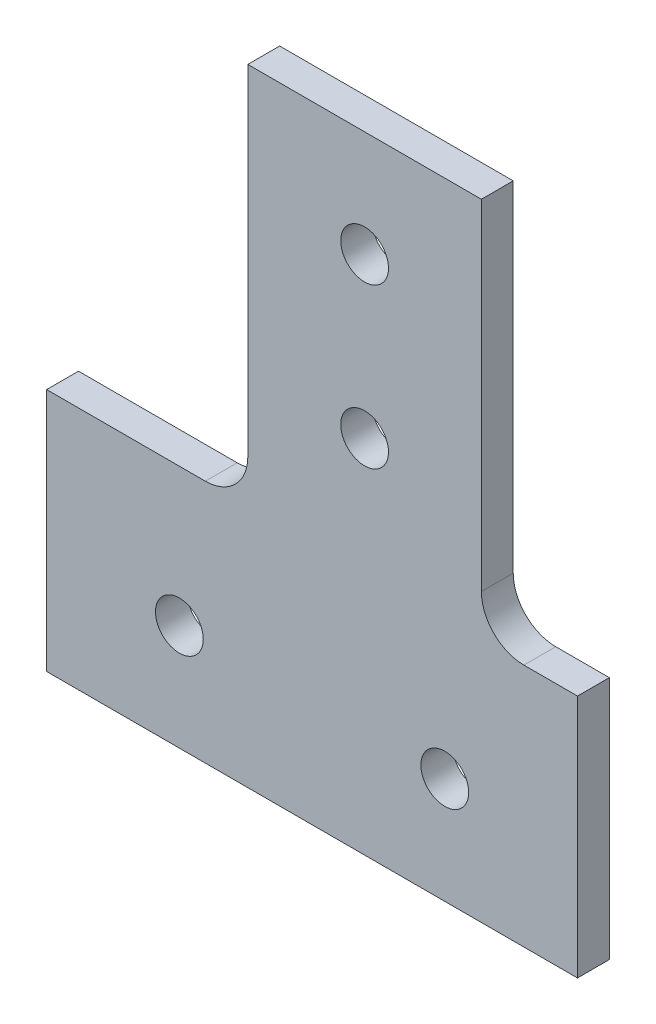
ISO-10303-21;
HEADER;
FILE_DESCRIPTION(('STEP AP214'),'2;1');
FILE_NAME('part.step','',(''),(''),'','','');
FILE_SCHEMA(('AUTOMOTIVE_DESIGN { 1 0 10303 214 1 1 1 1 }'));
ENDSEC;
DATA;
#1=APPLICATION_CONTEXT('core data for automotive mechanical design processes');
#2=APPLICATION_PROTOCOL_DEFINITION('international standard','automotive_design',2000,#1);
#3=PRODUCT_CONTEXT('',#1,'mechanical');
#4=PRODUCT('Part','Part','',(#3));
#5=PRODUCT_RELATED_PRODUCT_CATEGORY('part','',(#4));
#6=PRODUCT_DEFINITION_FORMATION('','',#4);
#7=PRODUCT_DEFINITION_CONTEXT('part definition',#1,'design');
#8=PRODUCT_DEFINITION('design','',#6,#7);
#9=PRODUCT_DEFINITION_SHAPE('','',#8);
#10=(LENGTH_UNIT() NAMED_UNIT(*) SI_UNIT(.MILLI.,.METRE.));
#11=(NAMED_UNIT(*) PLANE_ANGLE_UNIT() SI_UNIT($,.RADIAN.));
#12=(NAMED_UNIT(*) SI_UNIT($,.STERADIAN.) SOLID_ANGLE_UNIT());
#13=UNCERTAINTY_MEASURE_WITH_UNIT(LENGTH_MEASURE(1.E-05),#10,'distance_accuracy_value','');
#14=(GEOMETRIC_REPRESENTATION_CONTEXT(3) GLOBAL_UNCERTAINTY_ASSIGNED_CONTEXT((#13)) GLOBAL_UNIT_ASSIGNED_CONTEXT((#10,
#11,#12)) REPRESENTATION_CONTEXT('',''));
#15=CARTESIAN_POINT('',(0.,0.,0.));
#16=DIRECTION('',(0.,0.,1.));
#17=DIRECTION('',(1.,0.,0.));
#18=AXIS2_PLACEMENT_3D('',#15,#16,#17);
#19=CARTESIAN_POINT('',(-25.,-11.5,3.));
#20=DIRECTION('',(1.,0.,0.));
#21=DIRECTION('',(0.,0.,-1.));
#22=AXIS2_PLACEMENT_3D('',#19,#20,#21);
#23=PLANE('',#22);
#24=DIRECTION('',(0.,-1.,0.));
#25=VECTOR('',#24,1.);
#26=CARTESIAN_POINT('',(-25.,-11.5,0.));
#27=LINE('',#26,#25);
#28=CARTESIAN_POINT('',(-25.,11.5,0.));
#29=VERTEX_POINT('',#28);
#30=CARTESIAN_POINT('',(-25.,-11.5,0.));
#31=VERTEX_POINT('',#30);
#32=EDGE_CURVE('E150',#29,#31,#27,.T.);
#33=ORIENTED_EDGE('',*,*,#32,.T.);
#34=DIRECTION('',(0.,0.,-1.));
#35=VECTOR('',#34,1.);
#36=CARTESIAN_POINT('',(-25.,-11.5,3.));
#37=LINE('',#36,#35);
#38=CARTESIAN_POINT('',(-25.,-11.5,3.));
#39=VERTEX_POINT('',#38);
#40=EDGE_CURVE('E11',#39,#31,#37,.T.);
#41=ORIENTED_EDGE('',*,*,#40,.F.);
#42=DIRECTION('',(0.,-1.,0.));
#43=VECTOR('',#42,1.);
#44=CARTESIAN_POINT('',(-25.,-11.5,3.));
#45=LINE('',#44,#43);
#46=CARTESIAN_POINT('',(-25.,11.5,3.));
#47=VERTEX_POINT('',#46);
#48=EDGE_CURVE('E169',#47,#39,#45,.T.);
#49=ORIENTED_EDGE('',*,*,#48,.F.);
#50=DIRECTION('',(0.,0.,-1.));
#51=VECTOR('',#50,1.);
#52=CARTESIAN_POINT('',(-25.,11.5,3.));
#53=LINE('',#52,#51);
#54=EDGE_CURVE('E146',#47,#29,#53,.T.);
#55=ORIENTED_EDGE('',*,*,#54,.T.);
#56=EDGE_LOOP('',(#33,#41,#49,#55));
#57=FACE_BOUND('',#56,.T.);
#58=ADVANCED_FACE('F39',(#57),#23,.F.);
#59=CARTESIAN_POINT('',(25.,-11.5,3.));
#60=DIRECTION('',(0.,1.,0.));
#61=DIRECTION('',(-1.,0.,0.));
#62=AXIS2_PLACEMENT_3D('',#59,#60,#61);
#63=PLANE('',#62);
#64=DIRECTION('',(1.,0.,0.));
#65=VECTOR('',#64,1.);
#66=CARTESIAN_POINT('',(25.,-11.5,0.));
#67=LINE('',#66,#65);
#68=CARTESIAN_POINT('',(25.,-11.5,0.));
#69=VERTEX_POINT('',#68);
#70=EDGE_CURVE('E153',#31,#69,#67,.T.);
#71=ORIENTED_EDGE('',*,*,#70,.T.);
#72=DIRECTION('',(0.,0.,-1.));
#73=VECTOR('',#72,1.);
#74=CARTESIAN_POINT('',(25.,-11.5,3.));
#75=LINE('',#74,#73);
#76=CARTESIAN_POINT('',(25.,-11.5,3.));
#77=VERTEX_POINT('',#76);
#78=EDGE_CURVE('E46',#77,#69,#75,.T.);
#79=ORIENTED_EDGE('',*,*,#78,.F.);
#80=DIRECTION('',(1.,0.,0.));
#81=VECTOR('',#80,1.);
#82=CARTESIAN_POINT('',(25.,-11.5,3.));
#83=LINE('',#82,#81);
#84=EDGE_CURVE('E103',#39,#77,#83,.T.);
#85=ORIENTED_EDGE('',*,*,#84,.F.);
#86=ORIENTED_EDGE('',*,*,#40,.T.);
#87=EDGE_LOOP('',(#71,#79,#85,#86));
#88=FACE_BOUND('',#87,.T.);
#89=ADVANCED_FACE('F253',(#88),#63,.F.);
#90=CARTESIAN_POINT('',(25.,-11.5,3.));
#91=DIRECTION('',(-1.,0.,0.));
#92=DIRECTION('',(0.,0.,1.));
#93=AXIS2_PLACEMENT_3D('',#90,#91,#92);
#94=PLANE('',#93);
#95=DIRECTION('',(0.,1.,0.));
#96=VECTOR('',#95,1.);
#97=CARTESIAN_POINT('',(25.,-11.5,0.));
#98=LINE('',#97,#96);
#99=CARTESIAN_POINT('',(25.,11.5,0.));
#100=VERTEX_POINT('',#99);
#101=EDGE_CURVE('E156',#69,#100,#98,.T.);
#102=ORIENTED_EDGE('',*,*,#101,.T.);
#103=DIRECTION('',(0.,0.,-1.));
#104=VECTOR('',#103,1.);
#105=CARTESIAN_POINT('',(25.,11.5,3.));
#106=LINE('',#105,#104);
#107=CARTESIAN_POINT('',(25.,11.5,3.));
#108=VERTEX_POINT('',#107);
#109=EDGE_CURVE('E177',#108,#100,#106,.T.);
#110=ORIENTED_EDGE('',*,*,#109,.F.);
#111=DIRECTION('',(0.,1.,0.));
#112=VECTOR('',#111,1.);
#113=CARTESIAN_POINT('',(25.,-11.5,3.));
#114=LINE('',#113,#112);
#115=EDGE_CURVE('E185',#77,#108,#114,.T.);
#116=ORIENTED_EDGE('',*,*,#115,.F.);
#117=ORIENTED_EDGE('',*,*,#78,.T.);
#118=EDGE_LOOP('',(#102,#110,#116,#117));
#119=FACE_BOUND('',#118,.T.);
#120=ADVANCED_FACE('F183',(#119),#94,.F.);
#121=CARTESIAN_POINT('',(25.,11.5,3.));
#122=DIRECTION('',(0.,-1.,0.));
#123=DIRECTION('',(1.,0.,0.));
#124=AXIS2_PLACEMENT_3D('',#121,#122,#123);
#125=PLANE('',#124);
#126=DIRECTION('',(-1.,0.,0.));
#127=VECTOR('',#126,1.);
#128=CARTESIAN_POINT('',(25.,11.5,0.));
#129=LINE('',#128,#127);
#130=CARTESIAN_POINT('',(19.9473911,11.5,0.));
#131=VERTEX_POINT('',#130);
#132=EDGE_CURVE('E158',#100,#131,#129,.T.);
#133=ORIENTED_EDGE('',*,*,#132,.T.);
#134=DIRECTION('',(0.,0.,-1.));
#135=VECTOR('',#134,1.);
#136=CARTESIAN_POINT('',(19.9473911,11.5,3.));
#137=LINE('',#136,#135);
#138=CARTESIAN_POINT('',(19.9473911,11.5,3.));
#139=VERTEX_POINT('',#138);
#140=EDGE_CURVE('E174',#139,#131,#137,.T.);
#141=ORIENTED_EDGE('',*,*,#140,.F.);
#142=DIRECTION('',(-1.,0.,0.));
#143=VECTOR('',#142,1.);
#144=CARTESIAN_POINT('',(25.,11.5,3.));
#145=LINE('',#144,#143);
#146=EDGE_CURVE('E202',#108,#139,#145,.T.);
#147=ORIENTED_EDGE('',*,*,#146,.F.);
#148=ORIENTED_EDGE('',*,*,#109,.T.);
#149=EDGE_LOOP('',(#133,#141,#147,#148));
#150=FACE_BOUND('',#149,.T.);
#151=ADVANCED_FACE('F194',(#150),#125,.F.);
#152=CARTESIAN_POINT('',(19.9473911,15.5,3.));
#153=DIRECTION('',(0.,0.,-1.));
#154=DIRECTION('',(-1.,0.,0.));
#155=AXIS2_PLACEMENT_3D('',#152,#153,#154);
#156=CYLINDRICAL_SURFACE('',#155,4.);
#157=CARTESIAN_POINT('',(19.9473911,15.5,0.));
#158=DIRECTION('',(0.,0.,-1.));
#159=DIRECTION('',(-1.,0.,0.));
#160=AXIS2_PLACEMENT_3D('',#157,#158,#159);
#161=CIRCLE('',#160,4.);
#162=CARTESIAN_POINT('',(15.9473911,15.5,0.));
#163=VERTEX_POINT('',#162);
#164=EDGE_CURVE('E160',#131,#163,#161,.T.);
#165=ORIENTED_EDGE('',*,*,#164,.T.);
#166=DIRECTION('',(0.,0.,-1.));
#167=VECTOR('',#166,1.);
#168=CARTESIAN_POINT('',(15.9473911,15.5,3.));
#169=LINE('',#168,#167);
#170=CARTESIAN_POINT('',(15.9473911,15.5,3.));
#171=VERTEX_POINT('',#170);
#172=EDGE_CURVE('E141',#171,#163,#169,.T.);
#173=ORIENTED_EDGE('',*,*,#172,.F.);
#174=CARTESIAN_POINT('',(19.9473911,15.5,3.));
#175=DIRECTION('',(0.,0.,-1.));
#176=DIRECTION('',(-1.,0.,0.));
#177=AXIS2_PLACEMENT_3D('',#174,#175,#176);
#178=CIRCLE('',#177,4.);
#179=EDGE_CURVE('E200',#139,#171,#178,.T.);
#180=ORIENTED_EDGE('',*,*,#179,.F.);
#181=ORIENTED_EDGE('',*,*,#140,.T.);
#182=EDGE_LOOP('',(#165,#173,#180,#181));
#183=FACE_BOUND('',#182,.T.);
#184=ADVANCED_FACE('F198',(#183),#156,.F.);
#185=CARTESIAN_POINT('',(15.9473911,15.5,3.));
#186=DIRECTION('',(-1.,0.,0.));
#187=DIRECTION('',(0.,-1.,0.));
#188=AXIS2_PLACEMENT_3D('',#185,#186,#187);
#189=PLANE('',#188);
#190=DIRECTION('',(0.,1.,0.));
#191=VECTOR('',#190,1.);
#192=CARTESIAN_POINT('',(15.9473911,15.5,0.));
#193=LINE('',#192,#191);
#194=CARTESIAN_POINT('',(15.9473911,47.5,0.));
#195=VERTEX_POINT('',#194);
#196=EDGE_CURVE('E162',#163,#195,#193,.T.);
#197=ORIENTED_EDGE('',*,*,#196,.T.);
#198=DIRECTION('',(0.,0.,1.));
#199=VECTOR('',#198,1.);
#200=CARTESIAN_POINT('',(15.9473911,47.5,0.));
#201=LINE('',#200,#199);
#202=CARTESIAN_POINT('',(15.9473911,47.5,3.));
#203=VERTEX_POINT('',#202);
#204=EDGE_CURVE('E53',#195,#203,#201,.T.);
#205=ORIENTED_EDGE('',*,*,#204,.T.);
#206=DIRECTION('',(0.,1.,0.));
#207=VECTOR('',#206,1.);
#208=CARTESIAN_POINT('',(15.9473911,15.5,3.));
#209=LINE('',#208,#207);
#210=EDGE_CURVE('E132',#171,#203,#209,.T.);
#211=ORIENTED_EDGE('',*,*,#210,.F.);
#212=ORIENTED_EDGE('',*,*,#172,.T.);
#213=EDGE_LOOP('',(#197,#205,#211,#212));
#214=FACE_BOUND('',#213,.T.);
#215=ADVANCED_FACE('F239',(#214),#189,.F.);
#216=CARTESIAN_POINT('',(-6.0526089,15.5,3.));
#217=DIRECTION('',(1.,0.,0.));
#218=DIRECTION('',(0.,0.,-1.));
#219=AXIS2_PLACEMENT_3D('',#216,#217,#218);
#220=PLANE('',#219);
#221=DIRECTION('',(0.,-1.,0.));
#222=VECTOR('',#221,1.);
#223=CARTESIAN_POINT('',(-6.0526089,15.5,3.));
#224=LINE('',#223,#222);
#225=CARTESIAN_POINT('',(-6.0526089,47.5,3.));
#226=VERTEX_POINT('',#225);
#227=CARTESIAN_POINT('',(-6.0526089,15.5,3.));
#228=VERTEX_POINT('',#227);
#229=EDGE_CURVE('E120',#226,#228,#224,.T.);
#230=ORIENTED_EDGE('',*,*,#229,.F.);
#231=DIRECTION('',(0.,0.,1.));
#232=VECTOR('',#231,1.);
#233=CARTESIAN_POINT('',(-6.0526089,47.5,0.));
#234=LINE('',#233,#232);
#235=CARTESIAN_POINT('',(-6.0526089,47.5,0.));
#236=VERTEX_POINT('',#235);
#237=EDGE_CURVE('E232',#236,#226,#234,.T.);
#238=ORIENTED_EDGE('',*,*,#237,.F.);
#239=DIRECTION('',(0.,-1.,0.));
#240=VECTOR('',#239,1.);
#241=CARTESIAN_POINT('',(-6.0526089,15.5,0.));
#242=LINE('',#241,#240);
#243=CARTESIAN_POINT('',(-6.0526089,15.5,0.));
#244=VERTEX_POINT('',#243);
#245=EDGE_CURVE('E138',#236,#244,#242,.T.);
#246=ORIENTED_EDGE('',*,*,#245,.T.);
#247=DIRECTION('',(0.,0.,-1.));
#248=VECTOR('',#247,1.);
#249=CARTESIAN_POINT('',(-6.0526089,15.5,3.));
#250=LINE('',#249,#248);
#251=EDGE_CURVE('E135',#228,#244,#250,.T.);
#252=ORIENTED_EDGE('',*,*,#251,.F.);
#253=EDGE_LOOP('',(#230,#238,#246,#252));
#254=FACE_BOUND('',#253,.T.);
#255=ADVANCED_FACE('F136',(#254),#220,.F.);
#256=CARTESIAN_POINT('',(-10.0526089,15.5,3.));
#257=DIRECTION('',(0.,0.,-1.));
#258=DIRECTION('',(-1.,0.,0.));
#259=AXIS2_PLACEMENT_3D('',#256,#257,#258);
#260=CYLINDRICAL_SURFACE('',#259,4.);
#261=CARTESIAN_POINT('',(-10.0526089,15.5,0.));
#262=DIRECTION('',(0.,0.,-1.));
#263=DIRECTION('',(1.,0.,0.));
#264=AXIS2_PLACEMENT_3D('',#261,#262,#263);
#265=CIRCLE('',#264,4.);
#266=CARTESIAN_POINT('',(-10.0526089,11.5,0.));
#267=VERTEX_POINT('',#266);
#268=EDGE_CURVE('E166',#244,#267,#265,.T.);
#269=ORIENTED_EDGE('',*,*,#268,.T.);
#270=DIRECTION('',(0.,0.,-1.));
#271=VECTOR('',#270,1.);
#272=CARTESIAN_POINT('',(-10.0526089,11.5,3.));
#273=LINE('',#272,#271);
#274=CARTESIAN_POINT('',(-10.0526089,11.5,3.));
#275=VERTEX_POINT('',#274);
#276=EDGE_CURVE('E142',#275,#267,#273,.T.);
#277=ORIENTED_EDGE('',*,*,#276,.F.);
#278=CARTESIAN_POINT('',(-10.0526089,15.5,3.));
#279=DIRECTION('',(0.,0.,-1.));
#280=DIRECTION('',(1.,0.,0.));
#281=AXIS2_PLACEMENT_3D('',#278,#279,#280);
#282=CIRCLE('',#281,4.);
#283=EDGE_CURVE('E125',#228,#275,#282,.T.);
#284=ORIENTED_EDGE('',*,*,#283,.F.);
#285=ORIENTED_EDGE('',*,*,#251,.T.);
#286=EDGE_LOOP('',(#269,#277,#284,#285));
#287=FACE_BOUND('',#286,.T.);
#288=ADVANCED_FACE('F144',(#287),#260,.F.);
#289=CARTESIAN_POINT('',(-10.0526089,11.5,3.));
#290=DIRECTION('',(0.,-1.,0.));
#291=DIRECTION('',(1.,0.,0.));
#292=AXIS2_PLACEMENT_3D('',#289,#290,#291);
#293=PLANE('',#292);
#294=DIRECTION('',(-1.,0.,0.));
#295=VECTOR('',#294,1.);
#296=CARTESIAN_POINT('',(-10.0526089,11.5,0.));
#297=LINE('',#296,#295);
#298=EDGE_CURVE('E95',#267,#29,#297,.T.);
#299=ORIENTED_EDGE('',*,*,#298,.T.);
#300=ORIENTED_EDGE('',*,*,#54,.F.);
#301=DIRECTION('',(-1.,0.,0.));
#302=VECTOR('',#301,1.);
#303=CARTESIAN_POINT('',(-10.0526089,11.5,3.));
#304=LINE('',#303,#302);
#305=EDGE_CURVE('E62',#275,#47,#304,.T.);
#306=ORIENTED_EDGE('',*,*,#305,.F.);
#307=ORIENTED_EDGE('',*,*,#276,.T.);
#308=EDGE_LOOP('',(#299,#300,#306,#307));
#309=FACE_BOUND('',#308,.T.);
#310=ADVANCED_FACE('F260',(#309),#293,.F.);
#311=CARTESIAN_POINT('',(-10.0526089,15.5,3.));
#312=DIRECTION('',(0.,0.,1.));
#313=DIRECTION('',(1.,0.,0.));
#314=AXIS2_PLACEMENT_3D('',#311,#312,#313);
#315=PLANE('',#314);
#316=DIRECTION('',(1.,0.,0.));
#317=VECTOR('',#316,1.);
#318=CARTESIAN_POINT('',(15.9473911,47.5,3.));
#319=LINE('',#318,#317);
#320=EDGE_CURVE('E129',#226,#203,#319,.T.);
#321=ORIENTED_EDGE('',*,*,#320,.F.);
#322=ORIENTED_EDGE('',*,*,#229,.T.);
#323=ORIENTED_EDGE('',*,*,#283,.T.);
#324=ORIENTED_EDGE('',*,*,#305,.T.);
#325=ORIENTED_EDGE('',*,*,#48,.T.);
#326=ORIENTED_EDGE('',*,*,#84,.T.);
#327=ORIENTED_EDGE('',*,*,#115,.T.);
#328=ORIENTED_EDGE('',*,*,#146,.T.);
#329=ORIENTED_EDGE('',*,*,#179,.T.);
#330=ORIENTED_EDGE('',*,*,#210,.T.);
#331=EDGE_LOOP('',(#321,#322,#323,#324,#325,#326,#327,#328,#329,#330));
#332=FACE_BOUND('',#331,.T.);
#333=CARTESIAN_POINT('',(-12.5,-1.5,3.));
#334=DIRECTION('',(0.,0.,1.));
#335=DIRECTION('',(1.,0.,0.));
#336=AXIS2_PLACEMENT_3D('',#333,#334,#335);
#337=CIRCLE('',#336,2.24999999999999);
#338=CARTESIAN_POINT('',(-10.25,-1.5,3.));
#339=VERTEX_POINT('',#338);
#340=EDGE_CURVE('E229',#339,#339,#337,.T.);
#341=ORIENTED_EDGE('',*,*,#340,.F.);
#342=EDGE_LOOP('',(#341));
#343=FACE_BOUND('',#342,.T.);
#344=CARTESIAN_POINT('',(12.5,-1.5,3.));
#345=DIRECTION('',(0.,0.,1.));
#346=DIRECTION('',(1.,0.,0.));
#347=AXIS2_PLACEMENT_3D('',#344,#345,#346);
#348=CIRCLE('',#347,2.24999999999999);
#349=CARTESIAN_POINT('',(14.75,-1.5,3.));
#350=VERTEX_POINT('',#349);
#351=EDGE_CURVE('E223',#350,#350,#348,.T.);
#352=ORIENTED_EDGE('',*,*,#351,.F.);
#353=EDGE_LOOP('',(#352));
#354=FACE_BOUND('',#353,.T.);
#355=CARTESIAN_POINT('',(4.9473911,37.5,3.));
#356=DIRECTION('',(0.,0.,1.));
#357=DIRECTION('',(1.,0.,0.));
#358=AXIS2_PLACEMENT_3D('',#355,#356,#357);
#359=CIRCLE('',#358,2.25);
#360=CARTESIAN_POINT('',(7.1973911,37.5,3.));
#361=VERTEX_POINT('',#360);
#362=EDGE_CURVE('E217',#361,#361,#359,.T.);
#363=ORIENTED_EDGE('',*,*,#362,.F.);
#364=EDGE_LOOP('',(#363));
#365=FACE_BOUND('',#364,.T.);
#366=CARTESIAN_POINT('',(4.94739110000001,22.5,3.));
#367=DIRECTION('',(0.,0.,1.));
#368=DIRECTION('',(1.,0.,0.));
#369=AXIS2_PLACEMENT_3D('',#366,#367,#368);
#370=CIRCLE('',#369,2.25);
#371=CARTESIAN_POINT('',(7.19739110000001,22.5,3.));
#372=VERTEX_POINT('',#371);
#373=EDGE_CURVE('E211',#372,#372,#370,.T.);
#374=ORIENTED_EDGE('',*,*,#373,.F.);
#375=EDGE_LOOP('',(#374));
#376=FACE_BOUND('',#375,.T.);
#377=ADVANCED_FACE('F122',(#332,#343,#354,#365,#376),#315,.T.);
#378=CARTESIAN_POINT('',(-10.0526089,15.5,0.));
#379=DIRECTION('',(0.,0.,1.));
#380=DIRECTION('',(1.,0.,0.));
#381=AXIS2_PLACEMENT_3D('',#378,#379,#380);
#382=PLANE('',#381);
#383=CARTESIAN_POINT('',(-12.5,-1.5,0.));
#384=DIRECTION('',(0.,0.,1.));
#385=DIRECTION('',(1.,0.,0.));
#386=AXIS2_PLACEMENT_3D('',#383,#384,#385);
#387=CIRCLE('',#386,2.24999999999999);
#388=CARTESIAN_POINT('',(-10.25,-1.5,0.));
#389=VERTEX_POINT('',#388);
#390=EDGE_CURVE('E226',#389,#389,#387,.T.);
#391=ORIENTED_EDGE('',*,*,#390,.T.);
#392=EDGE_LOOP('',(#391));
#393=FACE_BOUND('',#392,.T.);
#394=CARTESIAN_POINT('',(12.5,-1.5,0.));
#395=DIRECTION('',(0.,0.,1.));
#396=DIRECTION('',(1.,0.,0.));
#397=AXIS2_PLACEMENT_3D('',#394,#395,#396);
#398=CIRCLE('',#397,2.24999999999999);
#399=CARTESIAN_POINT('',(14.75,-1.5,0.));
#400=VERTEX_POINT('',#399);
#401=EDGE_CURVE('E220',#400,#400,#398,.T.);
#402=ORIENTED_EDGE('',*,*,#401,.T.);
#403=EDGE_LOOP('',(#402));
#404=FACE_BOUND('',#403,.T.);
#405=CARTESIAN_POINT('',(4.9473911,37.5,0.));
#406=DIRECTION('',(0.,0.,1.));
#407=DIRECTION('',(1.,0.,0.));
#408=AXIS2_PLACEMENT_3D('',#405,#406,#407);
#409=CIRCLE('',#408,2.25);
#410=CARTESIAN_POINT('',(7.1973911,37.5,0.));
#411=VERTEX_POINT('',#410);
#412=EDGE_CURVE('E214',#411,#411,#409,.T.);
#413=ORIENTED_EDGE('',*,*,#412,.T.);
#414=EDGE_LOOP('',(#413));
#415=FACE_BOUND('',#414,.T.);
#416=CARTESIAN_POINT('',(4.94739110000001,22.5,0.));
#417=DIRECTION('',(0.,0.,1.));
#418=DIRECTION('',(1.,0.,0.));
#419=AXIS2_PLACEMENT_3D('',#416,#417,#418);
#420=CIRCLE('',#419,2.25);
#421=CARTESIAN_POINT('',(7.19739110000001,22.5,0.));
#422=VERTEX_POINT('',#421);
#423=EDGE_CURVE('E154',#422,#422,#420,.T.);
#424=ORIENTED_EDGE('',*,*,#423,.T.);
#425=EDGE_LOOP('',(#424));
#426=FACE_BOUND('',#425,.T.);
#427=ORIENTED_EDGE('',*,*,#245,.F.);
#428=DIRECTION('',(1.,0.,0.));
#429=VECTOR('',#428,1.);
#430=CARTESIAN_POINT('',(15.9473911,47.5,0.));
#431=LINE('',#430,#429);
#432=EDGE_CURVE('E235',#236,#195,#431,.T.);
#433=ORIENTED_EDGE('',*,*,#432,.T.);
#434=ORIENTED_EDGE('',*,*,#196,.F.);
#435=ORIENTED_EDGE('',*,*,#164,.F.);
#436=ORIENTED_EDGE('',*,*,#132,.F.);
#437=ORIENTED_EDGE('',*,*,#101,.F.);
#438=ORIENTED_EDGE('',*,*,#70,.F.);
#439=ORIENTED_EDGE('',*,*,#32,.F.);
#440=ORIENTED_EDGE('',*,*,#298,.F.);
#441=ORIENTED_EDGE('',*,*,#268,.F.);
#442=EDGE_LOOP('',(#427,#433,#434,#435,#436,#437,#438,#439,#440,#441));
#443=FACE_BOUND('',#442,.T.);
#444=ADVANCED_FACE('F188',(#393,#404,#415,#426,#443),#382,.F.);
#445=CARTESIAN_POINT('',(4.94739110000001,22.5,3.));
#446=DIRECTION('',(0.,0.,1.));
#447=DIRECTION('',(1.,0.,0.));
#448=AXIS2_PLACEMENT_3D('',#445,#446,#447);
#449=CYLINDRICAL_SURFACE('',#448,2.25);
#450=ORIENTED_EDGE('',*,*,#423,.F.);
#451=EDGE_LOOP('',(#450));
#452=FACE_BOUND('',#451,.T.);
#453=ORIENTED_EDGE('',*,*,#373,.T.);
#454=EDGE_LOOP('',(#453));
#455=FACE_BOUND('',#454,.T.);
#456=ADVANCED_FACE('F324',(#452,#455),#449,.F.);
#457=CARTESIAN_POINT('',(4.9473911,37.5,3.));
#458=DIRECTION('',(0.,0.,1.));
#459=DIRECTION('',(1.,0.,0.));
#460=AXIS2_PLACEMENT_3D('',#457,#458,#459);
#461=CYLINDRICAL_SURFACE('',#460,2.25);
#462=ORIENTED_EDGE('',*,*,#412,.F.);
#463=EDGE_LOOP('',(#462));
#464=FACE_BOUND('',#463,.T.);
#465=ORIENTED_EDGE('',*,*,#362,.T.);
#466=EDGE_LOOP('',(#465));
#467=FACE_BOUND('',#466,.T.);
#468=ADVANCED_FACE('F332',(#464,#467),#461,.F.);
#469=CARTESIAN_POINT('',(12.5,-1.5,3.));
#470=DIRECTION('',(0.,0.,1.));
#471=DIRECTION('',(1.,0.,0.));
#472=AXIS2_PLACEMENT_3D('',#469,#470,#471);
#473=CYLINDRICAL_SURFACE('',#472,2.24999999999999);
#474=ORIENTED_EDGE('',*,*,#401,.F.);
#475=EDGE_LOOP('',(#474));
#476=FACE_BOUND('',#475,.T.);
#477=ORIENTED_EDGE('',*,*,#351,.T.);
#478=EDGE_LOOP('',(#477));
#479=FACE_BOUND('',#478,.T.);
#480=ADVANCED_FACE('F249',(#476,#479),#473,.F.);
#481=CARTESIAN_POINT('',(-12.5,-1.5,3.));
#482=DIRECTION('',(0.,0.,1.));
#483=DIRECTION('',(1.,0.,0.));
#484=AXIS2_PLACEMENT_3D('',#481,#482,#483);
#485=CYLINDRICAL_SURFACE('',#484,2.24999999999999);
#486=ORIENTED_EDGE('',*,*,#390,.F.);
#487=EDGE_LOOP('',(#486));
#488=FACE_BOUND('',#487,.T.);
#489=ORIENTED_EDGE('',*,*,#340,.T.);
#490=EDGE_LOOP('',(#489));
#491=FACE_BOUND('',#490,.T.);
#492=ADVANCED_FACE('F243',(#488,#491),#485,.F.);
#493=CARTESIAN_POINT('',(15.9473911,47.5,0.));
#494=DIRECTION('',(0.,-1.,0.));
#495=DIRECTION('',(1.,0.,0.));
#496=AXIS2_PLACEMENT_3D('',#493,#494,#495);
#497=PLANE('',#496);
#498=ORIENTED_EDGE('',*,*,#320,.T.);
#499=ORIENTED_EDGE('',*,*,#204,.F.);
#500=ORIENTED_EDGE('',*,*,#432,.F.);
#501=ORIENTED_EDGE('',*,*,#237,.T.);
#502=EDGE_LOOP('',(#498,#499,#500,#501));
#503=FACE_BOUND('',#502,.T.);
#504=ADVANCED_FACE('F241',(#503),#497,.F.);
#505=CLOSED_SHELL('',(#58,#89,#120,#151,#184,#215,#255,#288,#310,#377,#444,#456,#468,#480,#492,#504));
#506=MANIFOLD_SOLID_BREP('B2',#505);
#507=ADVANCED_BREP_SHAPE_REPRESENTATION('',(#18,#506),#14);
#508=SHAPE_DEFINITION_REPRESENTATION(#9,#507);
ENDSEC;
END-ISO-10303-21;
